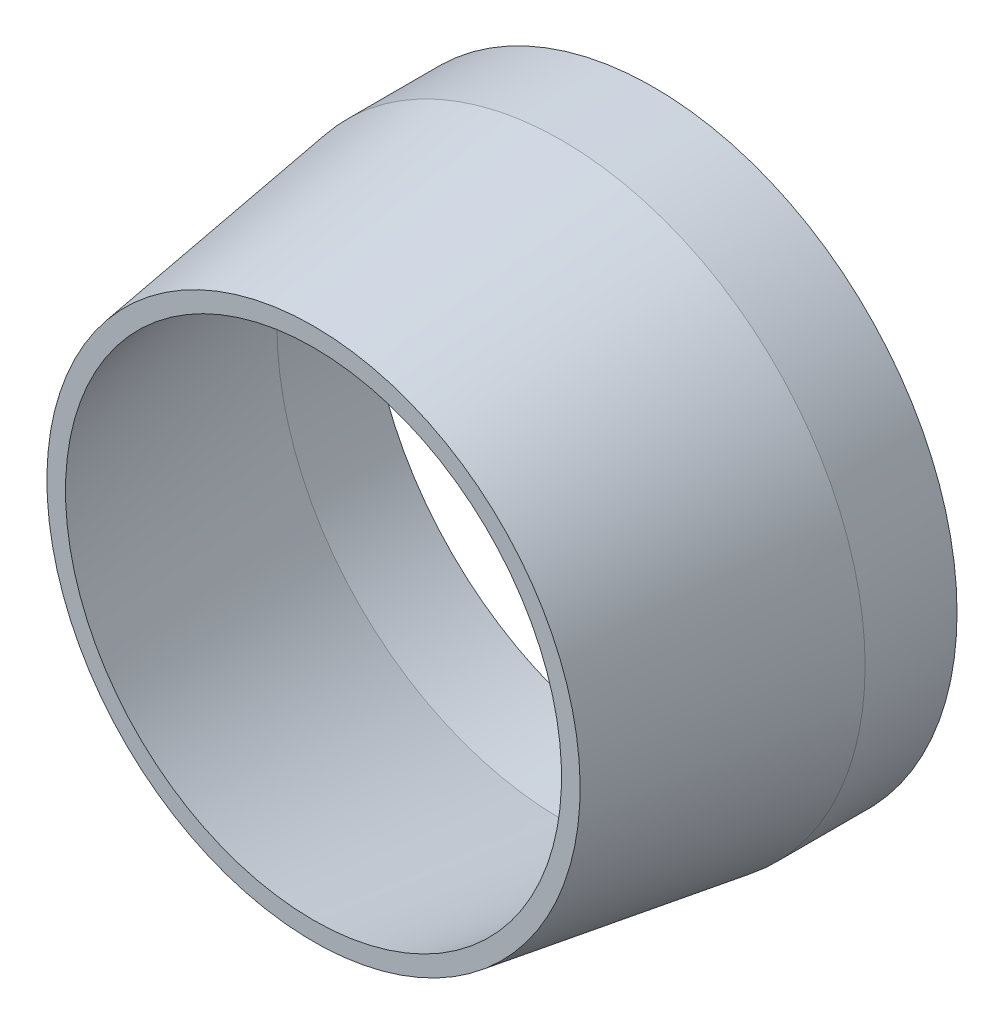
ISO-10303-21;
HEADER;
FILE_DESCRIPTION(('STEP AP214'),'2;1');
FILE_NAME('part.step','',(''),(''),'','','');
FILE_SCHEMA(('AUTOMOTIVE_DESIGN { 1 0 10303 214 1 1 1 1 }'));
ENDSEC;
DATA;
#1=APPLICATION_CONTEXT('core data for automotive mechanical design processes');
#2=APPLICATION_PROTOCOL_DEFINITION('international standard','automotive_design',2000,#1);
#3=PRODUCT_CONTEXT('',#1,'mechanical');
#4=PRODUCT('Part','Part','',(#3));
#5=PRODUCT_RELATED_PRODUCT_CATEGORY('part','',(#4));
#6=PRODUCT_DEFINITION_FORMATION('','',#4);
#7=PRODUCT_DEFINITION_CONTEXT('part definition',#1,'design');
#8=PRODUCT_DEFINITION('design','',#6,#7);
#9=PRODUCT_DEFINITION_SHAPE('','',#8);
#10=(LENGTH_UNIT() NAMED_UNIT(*) SI_UNIT(.MILLI.,.METRE.));
#11=(NAMED_UNIT(*) PLANE_ANGLE_UNIT() SI_UNIT($,.RADIAN.));
#12=(NAMED_UNIT(*) SI_UNIT($,.STERADIAN.) SOLID_ANGLE_UNIT());
#13=UNCERTAINTY_MEASURE_WITH_UNIT(LENGTH_MEASURE(1.E-05),#10,'distance_accuracy_value','');
#14=(GEOMETRIC_REPRESENTATION_CONTEXT(3) GLOBAL_UNCERTAINTY_ASSIGNED_CONTEXT((#13)) GLOBAL_UNIT_ASSIGNED_CONTEXT((#10,
#11,#12)) REPRESENTATION_CONTEXT('',''));
#15=CARTESIAN_POINT('',(0.,0.,0.));
#16=DIRECTION('',(0.,0.,1.));
#17=DIRECTION('',(1.,0.,0.));
#18=AXIS2_PLACEMENT_3D('',#15,#16,#17);
#19=CARTESIAN_POINT('',(0.,0.,0.));
#20=DIRECTION('',(0.,0.,1.));
#21=DIRECTION('',(1.,0.,0.));
#22=AXIS2_PLACEMENT_3D('',#19,#20,#21);
#23=PLANE('',#22);
#24=CARTESIAN_POINT('',(0.,0.,0.));
#25=DIRECTION('',(0.,0.,1.));
#26=DIRECTION('',(1.,0.,0.));
#27=AXIS2_PLACEMENT_3D('',#24,#25,#26);
#28=CIRCLE('',#27,3300.);
#29=CARTESIAN_POINT('',(3300.,0.,0.));
#30=VERTEX_POINT('',#29);
#31=EDGE_CURVE('E38',#30,#30,#28,.T.);
#32=ORIENTED_EDGE('',*,*,#31,.F.);
#33=EDGE_LOOP('',(#32));
#34=FACE_BOUND('',#33,.T.);
#35=CARTESIAN_POINT('',(0.,0.,0.));
#36=DIRECTION('',(0.,0.,1.));
#37=DIRECTION('',(1.,0.,0.));
#38=AXIS2_PLACEMENT_3D('',#35,#36,#37);
#39=CIRCLE('',#38,3100.);
#40=CARTESIAN_POINT('',(3100.,0.,0.));
#41=VERTEX_POINT('',#40);
#42=EDGE_CURVE('E45',#41,#41,#39,.T.);
#43=ORIENTED_EDGE('',*,*,#42,.T.);
#44=EDGE_LOOP('',(#43));
#45=FACE_BOUND('',#44,.T.);
#46=ADVANCED_FACE('F34',(#34,#45),#23,.F.);
#47=CARTESIAN_POINT('',(0.,0.,1000.));
#48=DIRECTION('',(0.,0.,-1.));
#49=DIRECTION('',(-1.,0.,0.));
#50=AXIS2_PLACEMENT_3D('',#47,#48,#49);
#51=CYLINDRICAL_SURFACE('',#50,3300.);
#52=CARTESIAN_POINT('',(0.,0.,1000.));
#53=DIRECTION('',(0.,0.,1.));
#54=DIRECTION('',(1.,0.,0.));
#55=AXIS2_PLACEMENT_3D('',#52,#53,#54);
#56=CIRCLE('',#55,3300.);
#57=CARTESIAN_POINT('',(3300.,0.,1000.));
#58=VERTEX_POINT('',#57);
#59=EDGE_CURVE('E10',#58,#58,#56,.T.);
#60=ORIENTED_EDGE('',*,*,#59,.F.);
#61=EDGE_LOOP('',(#60));
#62=FACE_BOUND('',#61,.T.);
#63=ORIENTED_EDGE('',*,*,#31,.T.);
#64=EDGE_LOOP('',(#63));
#65=FACE_BOUND('',#64,.T.);
#66=ADVANCED_FACE('F36',(#62,#65),#51,.T.);
#67=CARTESIAN_POINT('',(0.,0.,1000.));
#68=DIRECTION('',(0.,0.,-1.));
#69=DIRECTION('',(-1.,0.,0.));
#70=AXIS2_PLACEMENT_3D('',#67,#68,#69);
#71=CYLINDRICAL_SURFACE('',#70,3100.);
#72=CARTESIAN_POINT('',(0.,0.,1000.));
#73=DIRECTION('',(0.,0.,1.));
#74=DIRECTION('',(0.,-1.,0.));
#75=AXIS2_PLACEMENT_3D('',#72,#73,#74);
#76=CIRCLE('',#75,3100.);
#77=CARTESIAN_POINT('',(0.,-3100.,999.999999999999));
#78=VERTEX_POINT('',#77);
#79=EDGE_CURVE('E49',#78,#78,#76,.T.);
#80=ORIENTED_EDGE('',*,*,#79,.T.);
#81=EDGE_LOOP('',(#80));
#82=FACE_BOUND('',#81,.T.);
#83=ORIENTED_EDGE('',*,*,#42,.F.);
#84=EDGE_LOOP('',(#83));
#85=FACE_BOUND('',#84,.T.);
#86=ADVANCED_FACE('F68',(#82,#85),#71,.F.);
#87=CARTESIAN_POINT('',(0.,0.,3700.));
#88=DIRECTION('',(0.,0.,-1.));
#89=DIRECTION('',(0.,1.,0.));
#90=AXIS2_PLACEMENT_3D('',#87,#88,#89);
#91=PLANE('',#90);
#92=CARTESIAN_POINT('',(0.,-3.30654635769785E-13,3700.));
#93=DIRECTION('',(0.,0.,-1.));
#94=DIRECTION('',(0.,1.,0.));
#95=AXIS2_PLACEMENT_3D('',#92,#93,#94);
#96=CIRCLE('',#95,2900.);
#97=CARTESIAN_POINT('',(0.,2900.,3700.));
#98=VERTEX_POINT('',#97);
#99=EDGE_CURVE('E58',#98,#98,#96,.T.);
#100=ORIENTED_EDGE('',*,*,#99,.F.);
#101=EDGE_LOOP('',(#100));
#102=FACE_BOUND('',#101,.T.);
#103=CARTESIAN_POINT('',(0.,-3.30654635769785E-13,3700.));
#104=DIRECTION('',(0.,0.,-1.));
#105=DIRECTION('',(0.,1.,0.));
#106=AXIS2_PLACEMENT_3D('',#103,#104,#105);
#107=CIRCLE('',#106,2697.81712497843);
#108=CARTESIAN_POINT('',(0.,2697.81712497843,3700.));
#109=VERTEX_POINT('',#108);
#110=EDGE_CURVE('E52',#109,#109,#107,.T.);
#111=ORIENTED_EDGE('',*,*,#110,.T.);
#112=EDGE_LOOP('',(#111));
#113=FACE_BOUND('',#112,.T.);
#114=ADVANCED_FACE('F64',(#102,#113),#91,.F.);
#115=CARTESIAN_POINT('',(0.,-3.30654635769785E-13,3700.));
#116=DIRECTION('',(0.,0.,-1.));
#117=DIRECTION('',(0.,1.,0.));
#118=AXIS2_PLACEMENT_3D('',#115,#116,#117);
#119=CONICAL_SURFACE('',#118,2697.81712497843,0.147078355388403);
#120=CARTESIAN_POINT('',(0.,0.,1000.));
#121=DIRECTION('',(0.,0.,-1.));
#122=DIRECTION('',(0.,1.,0.));
#123=AXIS2_PLACEMENT_3D('',#120,#121,#122);
#124=CIRCLE('',#123,3097.81712497843);
#125=CARTESIAN_POINT('',(0.,3097.81712497843,1000.));
#126=VERTEX_POINT('',#125);
#127=EDGE_CURVE('E55',#126,#126,#124,.T.);
#128=ORIENTED_EDGE('',*,*,#127,.T.);
#129=EDGE_LOOP('',(#128));
#130=FACE_BOUND('',#129,.T.);
#131=ORIENTED_EDGE('',*,*,#110,.F.);
#132=EDGE_LOOP('',(#131));
#133=FACE_BOUND('',#132,.T.);
#134=ADVANCED_FACE('F67',(#130,#133),#119,.F.);
#135=CARTESIAN_POINT('',(0.,0.,1000.));
#136=DIRECTION('',(0.,0.,1.));
#137=DIRECTION('',(0.,-1.,0.));
#138=AXIS2_PLACEMENT_3D('',#135,#136,#137);
#139=PLANE('',#138);
#140=ORIENTED_EDGE('',*,*,#79,.F.);
#141=EDGE_LOOP('',(#140));
#142=FACE_BOUND('',#141,.T.);
#143=ORIENTED_EDGE('',*,*,#127,.F.);
#144=EDGE_LOOP('',(#143));
#145=FACE_BOUND('',#144,.T.);
#146=ADVANCED_FACE('F73',(#142,#145),#139,.F.);
#147=CARTESIAN_POINT('',(0.,-3.30654635769785E-13,3700.));
#148=DIRECTION('',(0.,0.,-1.));
#149=DIRECTION('',(0.,1.,0.));
#150=AXIS2_PLACEMENT_3D('',#147,#148,#149);
#151=CONICAL_SURFACE('',#150,2900.,0.147078355388402);
#152=ORIENTED_EDGE('',*,*,#59,.T.);
#153=EDGE_LOOP('',(#152));
#154=FACE_BOUND('',#153,.T.);
#155=ORIENTED_EDGE('',*,*,#99,.T.);
#156=EDGE_LOOP('',(#155));
#157=FACE_BOUND('',#156,.T.);
#158=ADVANCED_FACE('F62',(#154,#157),#151,.T.);
#159=CLOSED_SHELL('',(#46,#66,#86,#114,#134,#146,#158));
#160=MANIFOLD_SOLID_BREP('B2',#159);
#161=ADVANCED_BREP_SHAPE_REPRESENTATION('',(#18,#160),#14);
#162=SHAPE_DEFINITION_REPRESENTATION(#9,#161);
ENDSEC;
END-ISO-10303-21;
